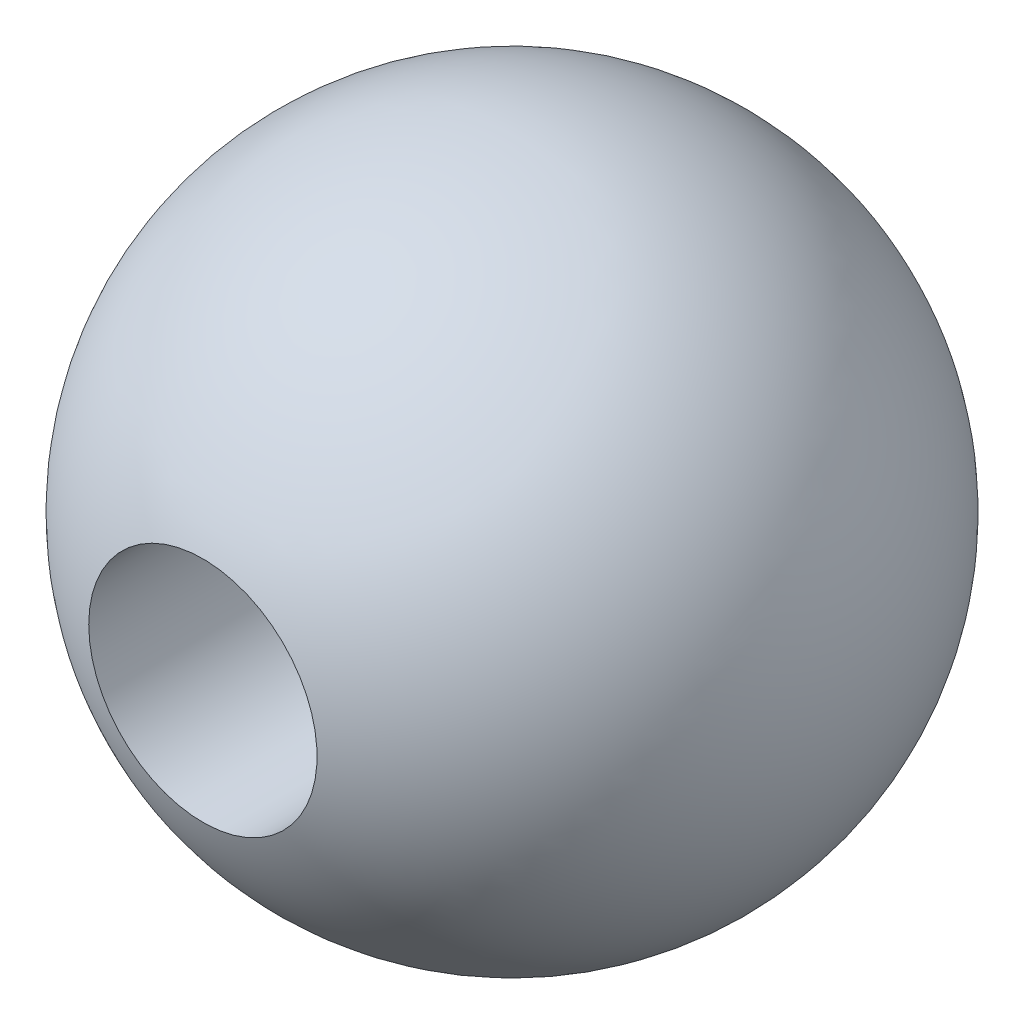
ISO-10303-21;
HEADER;
FILE_DESCRIPTION(('STEP AP214'),'2;1');
FILE_NAME('part.step','',(''),(''),'','','');
FILE_SCHEMA(('AUTOMOTIVE_DESIGN { 1 0 10303 214 1 1 1 1 }'));
ENDSEC;
DATA;
#1=APPLICATION_CONTEXT('core data for automotive mechanical design processes');
#2=APPLICATION_PROTOCOL_DEFINITION('international standard','automotive_design',2000,#1);
#3=PRODUCT_CONTEXT('',#1,'mechanical');
#4=PRODUCT('Part','Part','',(#3));
#5=PRODUCT_RELATED_PRODUCT_CATEGORY('part','',(#4));
#6=PRODUCT_DEFINITION_FORMATION('','',#4);
#7=PRODUCT_DEFINITION_CONTEXT('part definition',#1,'design');
#8=PRODUCT_DEFINITION('design','',#6,#7);
#9=PRODUCT_DEFINITION_SHAPE('','',#8);
#10=(LENGTH_UNIT() NAMED_UNIT(*) SI_UNIT(.MILLI.,.METRE.));
#11=(NAMED_UNIT(*) PLANE_ANGLE_UNIT() SI_UNIT($,.RADIAN.));
#12=(NAMED_UNIT(*) SI_UNIT($,.STERADIAN.) SOLID_ANGLE_UNIT());
#13=UNCERTAINTY_MEASURE_WITH_UNIT(LENGTH_MEASURE(1.E-05),#10,'distance_accuracy_value','');
#14=(GEOMETRIC_REPRESENTATION_CONTEXT(3) GLOBAL_UNCERTAINTY_ASSIGNED_CONTEXT((#13)) GLOBAL_UNIT_ASSIGNED_CONTEXT((#10,
#11,#12)) REPRESENTATION_CONTEXT('',''));
#15=CARTESIAN_POINT('',(0.,0.,0.));
#16=DIRECTION('',(0.,0.,1.));
#17=DIRECTION('',(1.,0.,0.));
#18=AXIS2_PLACEMENT_3D('',#15,#16,#17);
#19=CARTESIAN_POINT('',(0.,0.,0.));
#20=DIRECTION('',(0.,1.,0.));
#21=DIRECTION('',(1.,0.,0.));
#22=AXIS2_PLACEMENT_3D('',#19,#20,#21);
#23=SPHERICAL_SURFACE('',#22,2.165);
#24=CARTESIAN_POINT('',(0.,0.,0.));
#25=DIRECTION('',(0.,0.,-1.));
#26=DIRECTION('',(-1.,0.,0.));
#27=AXIS2_PLACEMENT_3D('',#24,#25,#26);
#28=SPHERICAL_SURFACE('',#27,2.165);
#29=CARTESIAN_POINT('',(0.,0.,2.03094189971057));
#30=DIRECTION('',(0.,0.,-1.));
#31=DIRECTION('',(-1.,0.,0.));
#32=AXIS2_PLACEMENT_3D('',#29,#30,#31);
#33=CIRCLE('',#32,0.75);
#34=CARTESIAN_POINT('',(-0.75,0.,2.03094189971057));
#35=VERTEX_POINT('',#34);
#36=EDGE_CURVE('E44',#35,#35,#33,.T.);
#37=ORIENTED_EDGE('',*,*,#36,.T.);
#38=EDGE_LOOP('',(#37));
#39=FACE_BOUND('',#38,.T.);
#40=CARTESIAN_POINT('',(0.,0.,-2.03094189971057));
#41=DIRECTION('',(0.,0.,1.));
#42=DIRECTION('',(1.,0.,0.));
#43=AXIS2_PLACEMENT_3D('',#40,#41,#42);
#44=CIRCLE('',#43,0.75);
#45=CARTESIAN_POINT('',(0.75,0.,-2.03094189971057));
#46=VERTEX_POINT('',#45);
#47=EDGE_CURVE('E10',#46,#46,#44,.T.);
#48=ORIENTED_EDGE('',*,*,#47,.T.);
#49=EDGE_LOOP('',(#48));
#50=FACE_BOUND('',#49,.T.);
#51=ADVANCED_FACE('F38',(#39,#50),#28,.T.);
#52=CARTESIAN_POINT('',(0.,0.,5.));
#53=DIRECTION('',(0.,0.,-1.));
#54=DIRECTION('',(-1.,0.,0.));
#55=AXIS2_PLACEMENT_3D('',#52,#53,#54);
#56=CYLINDRICAL_SURFACE('',#55,0.75);
#57=ORIENTED_EDGE('',*,*,#47,.F.);
#58=EDGE_LOOP('',(#57));
#59=FACE_BOUND('',#58,.T.);
#60=ORIENTED_EDGE('',*,*,#36,.F.);
#61=EDGE_LOOP('',(#60));
#62=FACE_BOUND('',#61,.T.);
#63=ADVANCED_FACE('F51',(#59,#62),#56,.F.);
#64=CLOSED_SHELL('',(#51,#63));
#65=MANIFOLD_SOLID_BREP('B2',#64);
#66=ADVANCED_BREP_SHAPE_REPRESENTATION('',(#18,#65),#14);
#67=SHAPE_DEFINITION_REPRESENTATION(#9,#66);
ENDSEC;
END-ISO-10303-21;
